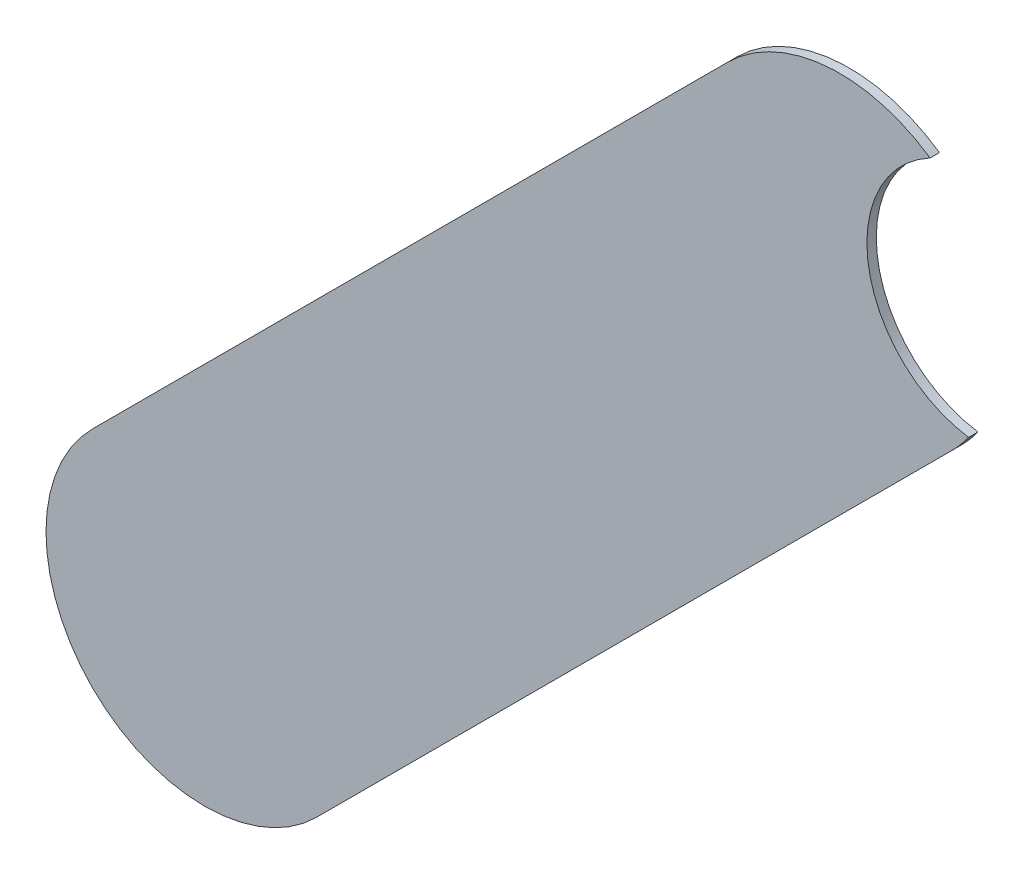
ISO-10303-21;
HEADER;
FILE_DESCRIPTION(('STEP AP214'),'2;1');
FILE_NAME('part.step','',(''),(''),'','','');
FILE_SCHEMA(('AUTOMOTIVE_DESIGN { 1 0 10303 214 1 1 1 1 }'));
ENDSEC;
DATA;
#1=APPLICATION_CONTEXT('core data for automotive mechanical design processes');
#2=APPLICATION_PROTOCOL_DEFINITION('international standard','automotive_design',2000,#1);
#3=PRODUCT_CONTEXT('',#1,'mechanical');
#4=PRODUCT('Part','Part','',(#3));
#5=PRODUCT_RELATED_PRODUCT_CATEGORY('part','',(#4));
#6=PRODUCT_DEFINITION_FORMATION('','',#4);
#7=PRODUCT_DEFINITION_CONTEXT('part definition',#1,'design');
#8=PRODUCT_DEFINITION('design','',#6,#7);
#9=PRODUCT_DEFINITION_SHAPE('','',#8);
#10=(LENGTH_UNIT() NAMED_UNIT(*) SI_UNIT(.MILLI.,.METRE.));
#11=(NAMED_UNIT(*) PLANE_ANGLE_UNIT() SI_UNIT($,.RADIAN.));
#12=(NAMED_UNIT(*) SI_UNIT($,.STERADIAN.) SOLID_ANGLE_UNIT());
#13=UNCERTAINTY_MEASURE_WITH_UNIT(LENGTH_MEASURE(1.E-05),#10,'distance_accuracy_value','');
#14=(GEOMETRIC_REPRESENTATION_CONTEXT(3) GLOBAL_UNCERTAINTY_ASSIGNED_CONTEXT((#13)) GLOBAL_UNIT_ASSIGNED_CONTEXT((#10,
#11,#12)) REPRESENTATION_CONTEXT('',''));
#15=CARTESIAN_POINT('',(0.,0.,0.));
#16=DIRECTION('',(0.,0.,1.));
#17=DIRECTION('',(1.,0.,0.));
#18=AXIS2_PLACEMENT_3D('',#15,#16,#17);
#19=CARTESIAN_POINT('',(33.3242793,68.07573126,0.));
#20=DIRECTION('',(-0.707114624692126,0.707098937593965,0.));
#21=DIRECTION('',(0.707098937593965,0.707114624692126,0.));
#22=AXIS2_PLACEMENT_3D('',#19,#20,#21);
#23=PLANE('',#22);
#24=DIRECTION('',(0.707098937593965,0.707114624692126,0.));
#25=VECTOR('',#24,1.);
#26=CARTESIAN_POINT('',(33.3242793,68.07573126,0.03556));
#27=LINE('',#26,#25);
#28=CARTESIAN_POINT('',(33.3242793,68.07573126,0.03556));
#29=VERTEX_POINT('',#28);
#30=CARTESIAN_POINT('',(35.72858996,70.48009526,0.03556));
#31=VERTEX_POINT('',#30);
#32=EDGE_CURVE('E11',#29,#31,#27,.T.);
#33=ORIENTED_EDGE('',*,*,#32,.F.);
#34=DIRECTION('',(0.,0.,1.));
#35=VECTOR('',#34,1.);
#36=CARTESIAN_POINT('',(33.3242793,68.07573126,0.));
#37=LINE('',#36,#35);
#38=CARTESIAN_POINT('',(33.3242793,68.07573126,0.));
#39=VERTEX_POINT('',#38);
#40=EDGE_CURVE('E24',#39,#29,#37,.T.);
#41=ORIENTED_EDGE('',*,*,#40,.F.);
#42=DIRECTION('',(0.707098937593965,0.707114624692126,0.));
#43=VECTOR('',#42,1.);
#44=CARTESIAN_POINT('',(33.3242793,68.07573126,0.));
#45=LINE('',#44,#43);
#46=CARTESIAN_POINT('',(35.72858996,70.48009526,0.));
#47=VERTEX_POINT('',#46);
#48=EDGE_CURVE('E88',#39,#47,#45,.T.);
#49=ORIENTED_EDGE('',*,*,#48,.T.);
#50=DIRECTION('',(0.,0.,1.));
#51=VECTOR('',#50,1.);
#52=CARTESIAN_POINT('',(35.72858996,70.48009526,0.));
#53=LINE('',#52,#51);
#54=EDGE_CURVE('E37',#47,#31,#53,.T.);
#55=ORIENTED_EDGE('',*,*,#54,.T.);
#56=EDGE_LOOP('',(#33,#41,#49,#55));
#57=FACE_BOUND('',#56,.T.);
#58=ADVANCED_FACE('F17',(#57),#23,.F.);
#59=CARTESIAN_POINT('',(35.3043223299886,70.9043539999886,0.));
#60=DIRECTION('',(0.,0.,-1.));
#61=DIRECTION('',(0.707114189515519,-0.707099372779959,0.));
#62=AXIS2_PLACEMENT_3D('',#59,#60,#61);
#63=CYLINDRICAL_SURFACE('',#62,0.59999875027554);
#64=CARTESIAN_POINT('',(35.3043223299886,70.9043539999886,0.03556));
#65=DIRECTION('',(0.,0.,1.));
#66=DIRECTION('',(0.707114189515519,-0.707099372779959,0.));
#67=AXIS2_PLACEMENT_3D('',#64,#65,#66);
#68=CIRCLE('',#67,0.59999875027554);
#69=CARTESIAN_POINT('',(35.7919398733576,70.5547433140377,0.03556));
#70=VERTEX_POINT('',#69);
#71=EDGE_CURVE('E111',#31,#70,#68,.T.);
#72=ORIENTED_EDGE('',*,*,#71,.F.);
#73=ORIENTED_EDGE('',*,*,#54,.F.);
#74=CARTESIAN_POINT('',(35.3043223299886,70.9043539999886,0.));
#75=DIRECTION('',(0.,0.,1.));
#76=DIRECTION('',(0.707114189515519,-0.707099372779959,0.));
#77=AXIS2_PLACEMENT_3D('',#74,#75,#76);
#78=CIRCLE('',#77,0.59999875027554);
#79=CARTESIAN_POINT('',(35.7919398733576,70.5547433140377,0.));
#80=VERTEX_POINT('',#79);
#81=EDGE_CURVE('E108',#47,#80,#78,.T.);
#82=ORIENTED_EDGE('',*,*,#81,.T.);
#83=DIRECTION('',(0.,0.,1.));
#84=VECTOR('',#83,1.);
#85=CARTESIAN_POINT('',(35.7919398733576,70.5547433140377,0.));
#86=LINE('',#85,#84);
#87=EDGE_CURVE('E106',#80,#70,#86,.T.);
#88=ORIENTED_EDGE('',*,*,#87,.T.);
#89=EDGE_LOOP('',(#72,#73,#82,#88));
#90=FACE_BOUND('',#89,.T.);
#91=ADVANCED_FACE('F118',(#90),#63,.T.);
#92=CARTESIAN_POINT('',(35.8570276,71.0000104,0.));
#93=DIRECTION('',(0.,0.,-1.));
#94=DIRECTION('',(1.,0.,0.));
#95=AXIS2_PLACEMENT_3D('',#92,#93,#94);
#96=CYLINDRICAL_SURFACE('',#95,0.4499991);
#97=DIRECTION('',(0.,0.,1.));
#98=VECTOR('',#97,1.);
#99=CARTESIAN_POINT('',(35.6460835977244,71.3975048249984,0.));
#100=LINE('',#99,#98);
#101=CARTESIAN_POINT('',(35.6460835977244,71.3975048249984,0.));
#102=VERTEX_POINT('',#101);
#103=CARTESIAN_POINT('',(35.6460835977244,71.3975048249984,0.03556));
#104=VERTEX_POINT('',#103);
#105=EDGE_CURVE('E104',#102,#104,#100,.T.);
#106=ORIENTED_EDGE('',*,*,#105,.T.);
#107=CARTESIAN_POINT('',(35.8570276,71.0000104,0.03556));
#108=DIRECTION('',(0.,0.,1.));
#109=DIRECTION('',(1.,0.,0.));
#110=AXIS2_PLACEMENT_3D('',#107,#108,#109);
#111=CIRCLE('',#110,0.4499991);
#112=EDGE_CURVE('E101',#104,#70,#111,.T.);
#113=ORIENTED_EDGE('',*,*,#112,.T.);
#114=ORIENTED_EDGE('',*,*,#87,.F.);
#115=CARTESIAN_POINT('',(35.8570276,71.0000104,0.));
#116=DIRECTION('',(0.,0.,1.));
#117=DIRECTION('',(1.,0.,0.));
#118=AXIS2_PLACEMENT_3D('',#115,#116,#117);
#119=CIRCLE('',#118,0.4499991);
#120=EDGE_CURVE('E98',#102,#80,#119,.T.);
#121=ORIENTED_EDGE('',*,*,#120,.F.);
#122=EDGE_LOOP('',(#106,#113,#114,#121));
#123=FACE_BOUND('',#122,.T.);
#124=ADVANCED_FACE('F124',(#123),#96,.F.);
#125=CARTESIAN_POINT('',(35.3043223299886,70.9043539999886,0.));
#126=DIRECTION('',(0.,0.,-1.));
#127=DIRECTION('',(0.707114189515519,-0.707099372779959,0.));
#128=AXIS2_PLACEMENT_3D('',#125,#126,#127);
#129=CYLINDRICAL_SURFACE('',#128,0.59999875027554);
#130=CARTESIAN_POINT('',(35.3043223299886,70.9043539999886,0.03556));
#131=DIRECTION('',(0.,0.,1.));
#132=DIRECTION('',(0.707114189515519,-0.707099372779959,0.));
#133=AXIS2_PLACEMENT_3D('',#130,#131,#132);
#134=CIRCLE('',#133,0.59999875027554);
#135=CARTESIAN_POINT('',(34.8800547,71.32861274,0.03556));
#136=VERTEX_POINT('',#135);
#137=EDGE_CURVE('E95',#104,#136,#134,.T.);
#138=ORIENTED_EDGE('',*,*,#137,.F.);
#139=ORIENTED_EDGE('',*,*,#105,.F.);
#140=CARTESIAN_POINT('',(34.8800547,71.32861274,0.));
#141=VERTEX_POINT('',#140);
#142=EDGE_CURVE('E94',#102,#141,#78,.T.);
#143=ORIENTED_EDGE('',*,*,#142,.T.);
#144=DIRECTION('',(0.,0.,1.));
#145=VECTOR('',#144,1.);
#146=CARTESIAN_POINT('',(34.8800547,71.32861274,0.));
#147=LINE('',#146,#145);
#148=EDGE_CURVE('E79',#141,#136,#147,.T.);
#149=ORIENTED_EDGE('',*,*,#148,.T.);
#150=EDGE_LOOP('',(#138,#139,#143,#149));
#151=FACE_BOUND('',#150,.T.);
#152=ADVANCED_FACE('F126',(#151),#129,.T.);
#153=CARTESIAN_POINT('',(34.8800547,71.32861274,0.));
#154=DIRECTION('',(0.707114624692126,-0.707098937593965,0.));
#155=DIRECTION('',(-0.707098937593965,-0.707114624692126,0.));
#156=AXIS2_PLACEMENT_3D('',#153,#154,#155);
#157=PLANE('',#156);
#158=DIRECTION('',(-0.707098937593965,-0.707114624692126,0.));
#159=VECTOR('',#158,1.);
#160=CARTESIAN_POINT('',(34.8800547,71.32861274,0.03556));
#161=LINE('',#160,#159);
#162=CARTESIAN_POINT('',(32.47574404,68.92424874,0.03556));
#163=VERTEX_POINT('',#162);
#164=EDGE_CURVE('E83',#136,#163,#161,.T.);
#165=ORIENTED_EDGE('',*,*,#164,.F.);
#166=ORIENTED_EDGE('',*,*,#148,.F.);
#167=DIRECTION('',(-0.707098937593965,-0.707114624692126,0.));
#168=VECTOR('',#167,1.);
#169=CARTESIAN_POINT('',(34.8800547,71.32861274,0.));
#170=LINE('',#169,#168);
#171=CARTESIAN_POINT('',(32.47574404,68.92424874,0.));
#172=VERTEX_POINT('',#171);
#173=EDGE_CURVE('E75',#141,#172,#170,.T.);
#174=ORIENTED_EDGE('',*,*,#173,.T.);
#175=DIRECTION('',(0.,0.,1.));
#176=VECTOR('',#175,1.);
#177=CARTESIAN_POINT('',(32.47574404,68.92424874,0.));
#178=LINE('',#177,#176);
#179=EDGE_CURVE('E65',#172,#163,#178,.T.);
#180=ORIENTED_EDGE('',*,*,#179,.T.);
#181=EDGE_LOOP('',(#165,#166,#174,#180));
#182=FACE_BOUND('',#181,.T.);
#183=ADVANCED_FACE('F78',(#182),#157,.F.);
#184=CARTESIAN_POINT('',(32.9000116700114,68.4999900000114,0.));
#185=DIRECTION('',(0.,0.,-1.));
#186=DIRECTION('',(-0.707114189515507,0.707099372779971,0.));
#187=AXIS2_PLACEMENT_3D('',#184,#185,#186);
#188=CYLINDRICAL_SURFACE('',#187,0.599998750275535);
#189=CARTESIAN_POINT('',(32.9000116700114,68.4999900000114,0.03556));
#190=DIRECTION('',(0.,0.,1.));
#191=DIRECTION('',(-0.707114189515507,0.707099372779971,0.));
#192=AXIS2_PLACEMENT_3D('',#189,#190,#191);
#193=CIRCLE('',#192,0.599998750275535);
#194=EDGE_CURVE('E71',#163,#29,#193,.T.);
#195=ORIENTED_EDGE('',*,*,#194,.F.);
#196=ORIENTED_EDGE('',*,*,#179,.F.);
#197=CARTESIAN_POINT('',(32.9000116700114,68.4999900000114,0.));
#198=DIRECTION('',(0.,0.,1.));
#199=DIRECTION('',(-0.707114189515507,0.707099372779971,0.));
#200=AXIS2_PLACEMENT_3D('',#197,#198,#199);
#201=CIRCLE('',#200,0.599998750275535);
#202=EDGE_CURVE('E69',#172,#39,#201,.T.);
#203=ORIENTED_EDGE('',*,*,#202,.T.);
#204=ORIENTED_EDGE('',*,*,#40,.T.);
#205=EDGE_LOOP('',(#195,#196,#203,#204));
#206=FACE_BOUND('',#205,.T.);
#207=ADVANCED_FACE('F67',(#206),#188,.T.);
#208=CARTESIAN_POINT('',(33.3242793,68.07573126,0.));
#209=DIRECTION('',(0.,0.,-1.));
#210=DIRECTION('',(-1.,0.,0.));
#211=AXIS2_PLACEMENT_3D('',#208,#209,#210);
#212=PLANE('',#211);
#213=ORIENTED_EDGE('',*,*,#48,.F.);
#214=ORIENTED_EDGE('',*,*,#202,.F.);
#215=ORIENTED_EDGE('',*,*,#173,.F.);
#216=ORIENTED_EDGE('',*,*,#142,.F.);
#217=ORIENTED_EDGE('',*,*,#120,.T.);
#218=ORIENTED_EDGE('',*,*,#81,.F.);
#219=EDGE_LOOP('',(#213,#214,#215,#216,#217,#218));
#220=FACE_BOUND('',#219,.T.);
#221=ADVANCED_FACE('F86',(#220),#212,.T.);
#222=CARTESIAN_POINT('',(33.3242793,68.07573126,0.03556));
#223=DIRECTION('',(0.,0.,-1.));
#224=DIRECTION('',(-1.,0.,0.));
#225=AXIS2_PLACEMENT_3D('',#222,#223,#224);
#226=PLANE('',#225);
#227=ORIENTED_EDGE('',*,*,#194,.T.);
#228=ORIENTED_EDGE('',*,*,#32,.T.);
#229=ORIENTED_EDGE('',*,*,#71,.T.);
#230=ORIENTED_EDGE('',*,*,#112,.F.);
#231=ORIENTED_EDGE('',*,*,#137,.T.);
#232=ORIENTED_EDGE('',*,*,#164,.T.);
#233=EDGE_LOOP('',(#227,#228,#229,#230,#231,#232));
#234=FACE_BOUND('',#233,.T.);
#235=ADVANCED_FACE('F121',(#234),#226,.F.);
#236=CLOSED_SHELL('',(#58,#91,#124,#152,#183,#207,#221,#235));
#237=MANIFOLD_SOLID_BREP('B1',#236);
#238=ADVANCED_BREP_SHAPE_REPRESENTATION('',(#18,#237),#14);
#239=SHAPE_DEFINITION_REPRESENTATION(#9,#238);
ENDSEC;
END-ISO-10303-21;
